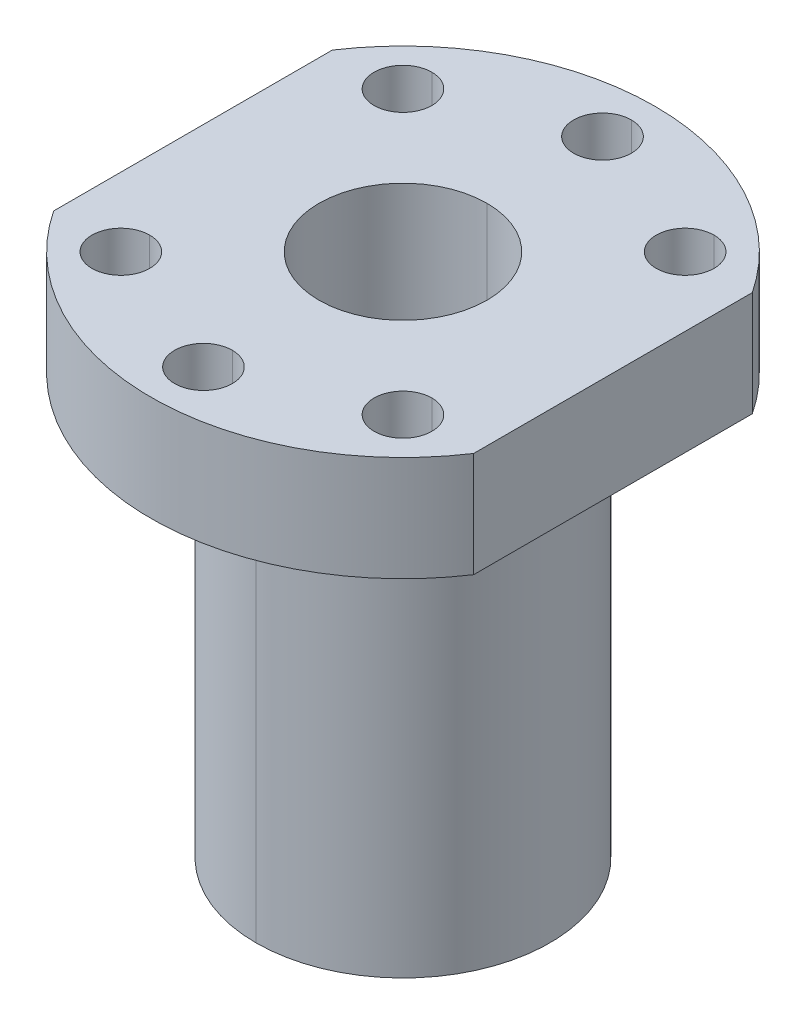
ISO-10303-21;
HEADER;
FILE_DESCRIPTION(('STEP AP214'),'2;1');
FILE_NAME('part.step','',(''),(''),'','','');
FILE_SCHEMA(('AUTOMOTIVE_DESIGN { 1 0 10303 214 1 1 1 1 }'));
ENDSEC;
DATA;
#1=APPLICATION_CONTEXT('core data for automotive mechanical design processes');
#2=APPLICATION_PROTOCOL_DEFINITION('international standard','automotive_design',2000,#1);
#3=PRODUCT_CONTEXT('',#1,'mechanical');
#4=PRODUCT('Part','Part','',(#3));
#5=PRODUCT_RELATED_PRODUCT_CATEGORY('part','',(#4));
#6=PRODUCT_DEFINITION_FORMATION('','',#4);
#7=PRODUCT_DEFINITION_CONTEXT('part definition',#1,'design');
#8=PRODUCT_DEFINITION('design','',#6,#7);
#9=PRODUCT_DEFINITION_SHAPE('','',#8);
#10=(LENGTH_UNIT() NAMED_UNIT(*) SI_UNIT(.MILLI.,.METRE.));
#11=(NAMED_UNIT(*) PLANE_ANGLE_UNIT() SI_UNIT($,.RADIAN.));
#12=(NAMED_UNIT(*) SI_UNIT($,.STERADIAN.) SOLID_ANGLE_UNIT());
#13=UNCERTAINTY_MEASURE_WITH_UNIT(LENGTH_MEASURE(1.E-05),#10,'distance_accuracy_value','');
#14=(GEOMETRIC_REPRESENTATION_CONTEXT(3) GLOBAL_UNCERTAINTY_ASSIGNED_CONTEXT((#13)) GLOBAL_UNIT_ASSIGNED_CONTEXT((#10,
#11,#12)) REPRESENTATION_CONTEXT('',''));
#15=CARTESIAN_POINT('',(0.,0.,0.));
#16=DIRECTION('',(0.,0.,1.));
#17=DIRECTION('',(1.,0.,0.));
#18=AXIS2_PLACEMENT_3D('',#15,#16,#17);
#19=CARTESIAN_POINT('',(-13.4350288425443,50.,13.4350288425446));
#20=DIRECTION('',(0.,1.,0.));
#21=DIRECTION('',(0.,0.,1.));
#22=AXIS2_PLACEMENT_3D('',#19,#20,#21);
#23=CYLINDRICAL_SURFACE('',#22,2.75);
#24=DIRECTION('',(0.,1.,0.));
#25=VECTOR('',#24,1.);
#26=CARTESIAN_POINT('',(-13.4350288425443,50.,10.6850288425446));
#27=LINE('',#26,#25);
#28=CARTESIAN_POINT('',(-13.4350288425443,40.,10.6850288425446));
#29=VERTEX_POINT('',#28);
#30=CARTESIAN_POINT('',(-13.4350288425443,50.,10.6850288425446));
#31=VERTEX_POINT('',#30);
#32=EDGE_CURVE('E430',#29,#31,#27,.T.);
#33=ORIENTED_EDGE('',*,*,#32,.F.);
#34=CARTESIAN_POINT('',(-13.4350288425443,40.,13.4350288425446));
#35=DIRECTION('',(0.,1.,0.));
#36=DIRECTION('',(0.,0.,1.));
#37=AXIS2_PLACEMENT_3D('',#34,#35,#36);
#38=CIRCLE('',#37,2.75);
#39=CARTESIAN_POINT('',(-13.4350288425443,40.,16.1850288425446));
#40=VERTEX_POINT('',#39);
#41=EDGE_CURVE('E233',#40,#29,#38,.T.);
#42=ORIENTED_EDGE('',*,*,#41,.F.);
#43=DIRECTION('',(0.,1.,0.));
#44=VECTOR('',#43,1.);
#45=CARTESIAN_POINT('',(-13.4350288425443,50.,16.1850288425446));
#46=LINE('',#45,#44);
#47=CARTESIAN_POINT('',(-13.4350288425443,50.,16.1850288425446));
#48=VERTEX_POINT('',#47);
#49=EDGE_CURVE('E271',#40,#48,#46,.T.);
#50=ORIENTED_EDGE('',*,*,#49,.T.);
#51=CARTESIAN_POINT('',(-13.4350288425443,50.,13.4350288425446));
#52=DIRECTION('',(0.,1.,0.));
#53=DIRECTION('',(0.,0.,1.));
#54=AXIS2_PLACEMENT_3D('',#51,#52,#53);
#55=CIRCLE('',#54,2.75);
#56=EDGE_CURVE('E223',#48,#31,#55,.T.);
#57=ORIENTED_EDGE('',*,*,#56,.T.);
#58=EDGE_LOOP('',(#33,#42,#50,#57));
#59=FACE_BOUND('',#58,.T.);
#60=ADVANCED_FACE('F16',(#59),#23,.F.);
#61=CARTESIAN_POINT('',(-13.4350288425446,50.,-13.4350288425443));
#62=DIRECTION('',(0.,1.,0.));
#63=DIRECTION('',(0.,0.,1.));
#64=AXIS2_PLACEMENT_3D('',#61,#62,#63);
#65=CYLINDRICAL_SURFACE('',#64,2.75);
#66=DIRECTION('',(0.,1.,0.));
#67=VECTOR('',#66,1.);
#68=CARTESIAN_POINT('',(-13.4350288425446,50.,-16.1850288425443));
#69=LINE('',#68,#67);
#70=CARTESIAN_POINT('',(-13.4350288425446,40.,-16.1850288425443));
#71=VERTEX_POINT('',#70);
#72=CARTESIAN_POINT('',(-13.4350288425446,50.,-16.1850288425443));
#73=VERTEX_POINT('',#72);
#74=EDGE_CURVE('E279',#71,#73,#69,.T.);
#75=ORIENTED_EDGE('',*,*,#74,.F.);
#76=CARTESIAN_POINT('',(-13.4350288425446,40.,-13.4350288425443));
#77=DIRECTION('',(0.,1.,0.));
#78=DIRECTION('',(0.,0.,1.));
#79=AXIS2_PLACEMENT_3D('',#76,#77,#78);
#80=CIRCLE('',#79,2.75);
#81=CARTESIAN_POINT('',(-13.4350288425446,40.,-10.6850288425443));
#82=VERTEX_POINT('',#81);
#83=EDGE_CURVE('E237',#82,#71,#80,.T.);
#84=ORIENTED_EDGE('',*,*,#83,.F.);
#85=DIRECTION('',(0.,1.,0.));
#86=VECTOR('',#85,1.);
#87=CARTESIAN_POINT('',(-13.4350288425446,50.,-10.6850288425443));
#88=LINE('',#87,#86);
#89=CARTESIAN_POINT('',(-13.4350288425446,50.,-10.6850288425443));
#90=VERTEX_POINT('',#89);
#91=EDGE_CURVE('E294',#82,#90,#88,.T.);
#92=ORIENTED_EDGE('',*,*,#91,.T.);
#93=CARTESIAN_POINT('',(-13.4350288425446,50.,-13.4350288425443));
#94=DIRECTION('',(0.,1.,0.));
#95=DIRECTION('',(0.,0.,1.));
#96=AXIS2_PLACEMENT_3D('',#93,#94,#95);
#97=CIRCLE('',#96,2.75);
#98=EDGE_CURVE('E226',#90,#73,#97,.T.);
#99=ORIENTED_EDGE('',*,*,#98,.T.);
#100=EDGE_LOOP('',(#75,#84,#92,#99));
#101=FACE_BOUND('',#100,.T.);
#102=ADVANCED_FACE('F827',(#101),#65,.F.);
#103=CARTESIAN_POINT('',(0.,50.,-19.));
#104=DIRECTION('',(0.,1.,0.));
#105=DIRECTION('',(0.,0.,1.));
#106=AXIS2_PLACEMENT_3D('',#103,#104,#105);
#107=CYLINDRICAL_SURFACE('',#106,2.75);
#108=DIRECTION('',(0.,1.,0.));
#109=VECTOR('',#108,1.);
#110=CARTESIAN_POINT('',(0.,50.,-21.75));
#111=LINE('',#110,#109);
#112=CARTESIAN_POINT('',(0.,40.,-21.75));
#113=VERTEX_POINT('',#112);
#114=CARTESIAN_POINT('',(0.,50.,-21.75));
#115=VERTEX_POINT('',#114);
#116=EDGE_CURVE('E286',#113,#115,#111,.T.);
#117=ORIENTED_EDGE('',*,*,#116,.F.);
#118=CARTESIAN_POINT('',(0.,40.,-19.));
#119=DIRECTION('',(0.,1.,0.));
#120=DIRECTION('',(0.,0.,1.));
#121=AXIS2_PLACEMENT_3D('',#118,#119,#120);
#122=CIRCLE('',#121,2.75);
#123=CARTESIAN_POINT('',(0.,40.,-16.25));
#124=VERTEX_POINT('',#123);
#125=EDGE_CURVE('E241',#124,#113,#122,.T.);
#126=ORIENTED_EDGE('',*,*,#125,.F.);
#127=DIRECTION('',(0.,1.,0.));
#128=VECTOR('',#127,1.);
#129=CARTESIAN_POINT('',(0.,50.,-16.25));
#130=LINE('',#129,#128);
#131=CARTESIAN_POINT('',(0.,50.,-16.25));
#132=VERTEX_POINT('',#131);
#133=EDGE_CURVE('E269',#124,#132,#130,.T.);
#134=ORIENTED_EDGE('',*,*,#133,.T.);
#135=CARTESIAN_POINT('',(0.,50.,-19.));
#136=DIRECTION('',(0.,1.,0.));
#137=DIRECTION('',(0.,0.,1.));
#138=AXIS2_PLACEMENT_3D('',#135,#136,#137);
#139=CIRCLE('',#138,2.75);
#140=EDGE_CURVE('E332',#132,#115,#139,.T.);
#141=ORIENTED_EDGE('',*,*,#140,.T.);
#142=EDGE_LOOP('',(#117,#126,#134,#141));
#143=FACE_BOUND('',#142,.T.);
#144=ADVANCED_FACE('F497',(#143),#107,.F.);
#145=CARTESIAN_POINT('',(13.4350288425444,50.,-13.4350288425445));
#146=DIRECTION('',(0.,1.,0.));
#147=DIRECTION('',(0.,0.,1.));
#148=AXIS2_PLACEMENT_3D('',#145,#146,#147);
#149=CYLINDRICAL_SURFACE('',#148,2.75);
#150=DIRECTION('',(0.,1.,0.));
#151=VECTOR('',#150,1.);
#152=CARTESIAN_POINT('',(13.4350288425444,50.,-16.1850288425445));
#153=LINE('',#152,#151);
#154=CARTESIAN_POINT('',(13.4350288425444,40.,-16.1850288425445));
#155=VERTEX_POINT('',#154);
#156=CARTESIAN_POINT('',(13.4350288425444,50.,-16.1850288425445));
#157=VERTEX_POINT('',#156);
#158=EDGE_CURVE('E299',#155,#157,#153,.T.);
#159=ORIENTED_EDGE('',*,*,#158,.F.);
#160=CARTESIAN_POINT('',(13.4350288425444,40.,-13.4350288425445));
#161=DIRECTION('',(0.,1.,0.));
#162=DIRECTION('',(0.,0.,1.));
#163=AXIS2_PLACEMENT_3D('',#160,#161,#162);
#164=CIRCLE('',#163,2.75);
#165=CARTESIAN_POINT('',(13.4350288425444,40.,-10.6850288425445));
#166=VERTEX_POINT('',#165);
#167=EDGE_CURVE('E242',#166,#155,#164,.T.);
#168=ORIENTED_EDGE('',*,*,#167,.F.);
#169=DIRECTION('',(0.,1.,0.));
#170=VECTOR('',#169,1.);
#171=CARTESIAN_POINT('',(13.4350288425444,50.,-10.6850288425445));
#172=LINE('',#171,#170);
#173=CARTESIAN_POINT('',(13.4350288425444,50.,-10.6850288425445));
#174=VERTEX_POINT('',#173);
#175=EDGE_CURVE('E308',#166,#174,#172,.T.);
#176=ORIENTED_EDGE('',*,*,#175,.T.);
#177=CARTESIAN_POINT('',(13.4350288425444,50.,-13.4350288425445));
#178=DIRECTION('',(0.,1.,0.));
#179=DIRECTION('',(0.,0.,1.));
#180=AXIS2_PLACEMENT_3D('',#177,#178,#179);
#181=CIRCLE('',#180,2.75);
#182=EDGE_CURVE('E328',#174,#157,#181,.T.);
#183=ORIENTED_EDGE('',*,*,#182,.T.);
#184=EDGE_LOOP('',(#159,#168,#176,#183));
#185=FACE_BOUND('',#184,.T.);
#186=ADVANCED_FACE('F742',(#185),#149,.F.);
#187=CARTESIAN_POINT('',(13.4350288425445,50.,13.4350288425444));
#188=DIRECTION('',(0.,1.,0.));
#189=DIRECTION('',(0.,0.,1.));
#190=AXIS2_PLACEMENT_3D('',#187,#188,#189);
#191=CYLINDRICAL_SURFACE('',#190,2.75);
#192=DIRECTION('',(0.,1.,0.));
#193=VECTOR('',#192,1.);
#194=CARTESIAN_POINT('',(13.4350288425445,50.,10.6850288425444));
#195=LINE('',#194,#193);
#196=CARTESIAN_POINT('',(13.4350288425445,40.,10.6850288425444));
#197=VERTEX_POINT('',#196);
#198=CARTESIAN_POINT('',(13.4350288425445,50.,10.6850288425444));
#199=VERTEX_POINT('',#198);
#200=EDGE_CURVE('E312',#197,#199,#195,.T.);
#201=ORIENTED_EDGE('',*,*,#200,.F.);
#202=CARTESIAN_POINT('',(13.4350288425445,40.,13.4350288425444));
#203=DIRECTION('',(0.,1.,0.));
#204=DIRECTION('',(0.,0.,1.));
#205=AXIS2_PLACEMENT_3D('',#202,#203,#204);
#206=CIRCLE('',#205,2.75);
#207=CARTESIAN_POINT('',(13.4350288425445,40.,16.1850288425444));
#208=VERTEX_POINT('',#207);
#209=EDGE_CURVE('E246',#208,#197,#206,.T.);
#210=ORIENTED_EDGE('',*,*,#209,.F.);
#211=DIRECTION('',(0.,1.,0.));
#212=VECTOR('',#211,1.);
#213=CARTESIAN_POINT('',(13.4350288425445,50.,16.1850288425444));
#214=LINE('',#213,#212);
#215=CARTESIAN_POINT('',(13.4350288425445,50.,16.1850288425444));
#216=VERTEX_POINT('',#215);
#217=EDGE_CURVE('E321',#208,#216,#214,.T.);
#218=ORIENTED_EDGE('',*,*,#217,.T.);
#219=CARTESIAN_POINT('',(13.4350288425445,50.,13.4350288425444));
#220=DIRECTION('',(0.,1.,0.));
#221=DIRECTION('',(0.,0.,1.));
#222=AXIS2_PLACEMENT_3D('',#219,#220,#221);
#223=CIRCLE('',#222,2.75);
#224=EDGE_CURVE('E204',#216,#199,#223,.T.);
#225=ORIENTED_EDGE('',*,*,#224,.T.);
#226=EDGE_LOOP('',(#201,#210,#218,#225));
#227=FACE_BOUND('',#226,.T.);
#228=ADVANCED_FACE('F402',(#227),#191,.F.);
#229=CARTESIAN_POINT('',(0.,50.,19.));
#230=DIRECTION('',(0.,1.,0.));
#231=DIRECTION('',(0.,0.,1.));
#232=AXIS2_PLACEMENT_3D('',#229,#230,#231);
#233=CYLINDRICAL_SURFACE('',#232,2.75);
#234=DIRECTION('',(0.,1.,0.));
#235=VECTOR('',#234,1.);
#236=CARTESIAN_POINT('',(0.,50.,16.25));
#237=LINE('',#236,#235);
#238=CARTESIAN_POINT('',(0.,40.,16.25));
#239=VERTEX_POINT('',#238);
#240=CARTESIAN_POINT('',(0.,50.,16.25));
#241=VERTEX_POINT('',#240);
#242=EDGE_CURVE('E322',#239,#241,#237,.T.);
#243=ORIENTED_EDGE('',*,*,#242,.F.);
#244=CARTESIAN_POINT('',(0.,40.,19.));
#245=DIRECTION('',(0.,1.,0.));
#246=DIRECTION('',(0.,0.,1.));
#247=AXIS2_PLACEMENT_3D('',#244,#245,#246);
#248=CIRCLE('',#247,2.75);
#249=CARTESIAN_POINT('',(0.,40.,21.75));
#250=VERTEX_POINT('',#249);
#251=EDGE_CURVE('E250',#250,#239,#248,.T.);
#252=ORIENTED_EDGE('',*,*,#251,.F.);
#253=DIRECTION('',(0.,1.,0.));
#254=VECTOR('',#253,1.);
#255=CARTESIAN_POINT('',(0.,50.,21.75));
#256=LINE('',#255,#254);
#257=CARTESIAN_POINT('',(0.,50.,21.75));
#258=VERTEX_POINT('',#257);
#259=EDGE_CURVE('E167',#250,#258,#256,.T.);
#260=ORIENTED_EDGE('',*,*,#259,.T.);
#261=CARTESIAN_POINT('',(0.,50.,19.));
#262=DIRECTION('',(0.,1.,0.));
#263=DIRECTION('',(0.,0.,1.));
#264=AXIS2_PLACEMENT_3D('',#261,#262,#263);
#265=CIRCLE('',#264,2.75);
#266=EDGE_CURVE('E150',#258,#241,#265,.T.);
#267=ORIENTED_EDGE('',*,*,#266,.T.);
#268=EDGE_LOOP('',(#243,#252,#260,#267));
#269=FACE_BOUND('',#268,.T.);
#270=ADVANCED_FACE('F352',(#269),#233,.F.);
#271=CARTESIAN_POINT('',(20.,40.,24.));
#272=DIRECTION('',(1.,0.,0.));
#273=DIRECTION('',(0.,1.,0.));
#274=AXIS2_PLACEMENT_3D('',#271,#272,#273);
#275=PLANE('',#274);
#276=DIRECTION('',(0.,-1.,0.));
#277=VECTOR('',#276,1.);
#278=CARTESIAN_POINT('',(20.,50.,13.2664991614216));
#279=LINE('',#278,#277);
#280=CARTESIAN_POINT('',(20.,50.,13.2664991614216));
#281=VERTEX_POINT('',#280);
#282=CARTESIAN_POINT('',(20.,40.,13.2664991614216));
#283=VERTEX_POINT('',#282);
#284=EDGE_CURVE('E200',#281,#283,#279,.T.);
#285=ORIENTED_EDGE('',*,*,#284,.T.);
#286=DIRECTION('',(0.,0.,-1.));
#287=VECTOR('',#286,1.);
#288=CARTESIAN_POINT('',(20.0000000000001,40.,0.));
#289=LINE('',#288,#287);
#290=CARTESIAN_POINT('',(20.0000000000001,40.,-13.2664991614216));
#291=VERTEX_POINT('',#290);
#292=EDGE_CURVE('E37',#283,#291,#289,.T.);
#293=ORIENTED_EDGE('',*,*,#292,.T.);
#294=DIRECTION('',(0.,1.,0.));
#295=VECTOR('',#294,1.);
#296=CARTESIAN_POINT('',(20.0000000000001,50.,-13.2664991614216));
#297=LINE('',#296,#295);
#298=CARTESIAN_POINT('',(20.0000000000001,50.,-13.2664991614216));
#299=VERTEX_POINT('',#298);
#300=EDGE_CURVE('E213',#291,#299,#297,.T.);
#301=ORIENTED_EDGE('',*,*,#300,.T.);
#302=DIRECTION('',(0.,0.,-1.));
#303=VECTOR('',#302,1.);
#304=CARTESIAN_POINT('',(20.,50.,24.));
#305=LINE('',#304,#303);
#306=EDGE_CURVE('E51',#281,#299,#305,.T.);
#307=ORIENTED_EDGE('',*,*,#306,.F.);
#308=EDGE_LOOP('',(#285,#293,#301,#307));
#309=FACE_BOUND('',#308,.T.);
#310=ADVANCED_FACE('F796',(#309),#275,.T.);
#311=CARTESIAN_POINT('',(-20.,40.,24.));
#312=DIRECTION('',(-1.,0.,0.));
#313=DIRECTION('',(0.,0.,1.));
#314=AXIS2_PLACEMENT_3D('',#311,#312,#313);
#315=PLANE('',#314);
#316=DIRECTION('',(0.,-1.,0.));
#317=VECTOR('',#316,1.);
#318=CARTESIAN_POINT('',(-20.0000000000001,50.,-13.2664991614216));
#319=LINE('',#318,#317);
#320=CARTESIAN_POINT('',(-20.0000000000001,50.,-13.2664991614216));
#321=VERTEX_POINT('',#320);
#322=CARTESIAN_POINT('',(-20.0000000000001,40.,-13.2664991614216));
#323=VERTEX_POINT('',#322);
#324=EDGE_CURVE('E191',#321,#323,#319,.T.);
#325=ORIENTED_EDGE('',*,*,#324,.T.);
#326=DIRECTION('',(0.,0.,1.));
#327=VECTOR('',#326,1.);
#328=CARTESIAN_POINT('',(-20.0000000000001,40.,0.));
#329=LINE('',#328,#327);
#330=CARTESIAN_POINT('',(-20.0000000000001,40.,13.2664991614216));
#331=VERTEX_POINT('',#330);
#332=EDGE_CURVE('E230',#323,#331,#329,.T.);
#333=ORIENTED_EDGE('',*,*,#332,.T.);
#334=DIRECTION('',(0.,1.,0.));
#335=VECTOR('',#334,1.);
#336=CARTESIAN_POINT('',(-20.0000000000001,50.,13.2664991614216));
#337=LINE('',#336,#335);
#338=CARTESIAN_POINT('',(-20.0000000000001,50.,13.2664991614216));
#339=VERTEX_POINT('',#338);
#340=EDGE_CURVE('E195',#331,#339,#337,.T.);
#341=ORIENTED_EDGE('',*,*,#340,.T.);
#342=DIRECTION('',(0.,0.,1.));
#343=VECTOR('',#342,1.);
#344=CARTESIAN_POINT('',(-20.,50.,24.));
#345=LINE('',#344,#343);
#346=EDGE_CURVE('E120',#321,#339,#345,.T.);
#347=ORIENTED_EDGE('',*,*,#346,.F.);
#348=EDGE_LOOP('',(#325,#333,#341,#347));
#349=FACE_BOUND('',#348,.T.);
#350=ADVANCED_FACE('F764',(#349),#315,.T.);
#351=CARTESIAN_POINT('',(0.,-0.001000000000001,0.));
#352=DIRECTION('',(0.,1.,0.));
#353=DIRECTION('',(0.,0.,1.));
#354=AXIS2_PLACEMENT_3D('',#351,#352,#353);
#355=CYLINDRICAL_SURFACE('',#354,8.);
#356=DIRECTION('',(0.,1.,0.));
#357=VECTOR('',#356,1.);
#358=CARTESIAN_POINT('',(0.,-0.001000000000001,-8.00000000000001));
#359=LINE('',#358,#357);
#360=CARTESIAN_POINT('',(0.,0.,-8.00000000000001));
#361=VERTEX_POINT('',#360);
#362=CARTESIAN_POINT('',(0.,50.,-8.00000000000001));
#363=VERTEX_POINT('',#362);
#364=EDGE_CURVE('E143',#361,#363,#359,.T.);
#365=ORIENTED_EDGE('',*,*,#364,.F.);
#366=CARTESIAN_POINT('',(0.,0.,0.));
#367=DIRECTION('',(0.,-1.,0.));
#368=DIRECTION('',(0.,0.,1.));
#369=AXIS2_PLACEMENT_3D('',#366,#367,#368);
#370=CIRCLE('',#369,8.);
#371=CARTESIAN_POINT('',(0.,0.,8.00000000000001));
#372=VERTEX_POINT('',#371);
#373=EDGE_CURVE('E11',#361,#372,#370,.T.);
#374=ORIENTED_EDGE('',*,*,#373,.T.);
#375=DIRECTION('',(0.,1.,0.));
#376=VECTOR('',#375,1.);
#377=CARTESIAN_POINT('',(0.,-0.001000000000001,8.00000000000001));
#378=LINE('',#377,#376);
#379=CARTESIAN_POINT('',(0.,50.,8.00000000000001));
#380=VERTEX_POINT('',#379);
#381=EDGE_CURVE('E146',#372,#380,#378,.T.);
#382=ORIENTED_EDGE('',*,*,#381,.T.);
#383=CARTESIAN_POINT('',(0.,50.,0.));
#384=DIRECTION('',(0.,1.,0.));
#385=DIRECTION('',(0.,0.,1.));
#386=AXIS2_PLACEMENT_3D('',#383,#384,#385);
#387=CIRCLE('',#386,8.);
#388=EDGE_CURVE('E139',#380,#363,#387,.T.);
#389=ORIENTED_EDGE('',*,*,#388,.T.);
#390=EDGE_LOOP('',(#365,#374,#382,#389));
#391=FACE_BOUND('',#390,.T.);
#392=ADVANCED_FACE('F141',(#391),#355,.F.);
#393=CARTESIAN_POINT('',(0.,0.,0.));
#394=DIRECTION('',(0.,1.,0.));
#395=DIRECTION('',(1.,0.,0.));
#396=AXIS2_PLACEMENT_3D('',#393,#394,#395);
#397=PLANE('',#396);
#398=CARTESIAN_POINT('',(0.,0.,0.));
#399=DIRECTION('',(0.,-1.,0.));
#400=DIRECTION('',(0.,0.,1.));
#401=AXIS2_PLACEMENT_3D('',#398,#399,#400);
#402=CIRCLE('',#401,8.);
#403=EDGE_CURVE('E160',#372,#361,#402,.T.);
#404=ORIENTED_EDGE('',*,*,#403,.F.);
#405=ORIENTED_EDGE('',*,*,#373,.F.);
#406=EDGE_LOOP('',(#404,#405));
#407=FACE_BOUND('',#406,.T.);
#408=CARTESIAN_POINT('',(0.,0.,0.));
#409=DIRECTION('',(0.,1.,0.));
#410=DIRECTION('',(0.,0.,1.));
#411=AXIS2_PLACEMENT_3D('',#408,#409,#410);
#412=CIRCLE('',#411,14.);
#413=CARTESIAN_POINT('',(0.,0.,-14.));
#414=VERTEX_POINT('',#413);
#415=CARTESIAN_POINT('',(0.,0.,14.));
#416=VERTEX_POINT('',#415);
#417=EDGE_CURVE('E24',#414,#416,#412,.T.);
#418=ORIENTED_EDGE('',*,*,#417,.F.);
#419=CARTESIAN_POINT('',(0.,0.,0.));
#420=DIRECTION('',(0.,1.,0.));
#421=DIRECTION('',(0.,0.,1.));
#422=AXIS2_PLACEMENT_3D('',#419,#420,#421);
#423=CIRCLE('',#422,14.);
#424=EDGE_CURVE('E178',#416,#414,#423,.T.);
#425=ORIENTED_EDGE('',*,*,#424,.F.);
#426=EDGE_LOOP('',(#418,#425));
#427=FACE_BOUND('',#426,.T.);
#428=ADVANCED_FACE('F657',(#407,#427),#397,.F.);
#429=CARTESIAN_POINT('',(0.,40.,0.));
#430=DIRECTION('',(0.,-1.,0.));
#431=DIRECTION('',(0.,0.,-1.));
#432=AXIS2_PLACEMENT_3D('',#429,#430,#431);
#433=CYLINDRICAL_SURFACE('',#432,14.);
#434=DIRECTION('',(0.,-1.,0.));
#435=VECTOR('',#434,1.);
#436=CARTESIAN_POINT('',(0.,40.,14.));
#437=LINE('',#436,#435);
#438=CARTESIAN_POINT('',(0.,40.,14.));
#439=VERTEX_POINT('',#438);
#440=EDGE_CURVE('E170',#439,#416,#437,.T.);
#441=ORIENTED_EDGE('',*,*,#440,.F.);
#442=CARTESIAN_POINT('',(0.,40.,0.));
#443=DIRECTION('',(0.,1.,0.));
#444=DIRECTION('',(0.,0.,1.));
#445=AXIS2_PLACEMENT_3D('',#442,#443,#444);
#446=CIRCLE('',#445,14.);
#447=CARTESIAN_POINT('',(0.,40.,-14.));
#448=VERTEX_POINT('',#447);
#449=EDGE_CURVE('E252',#448,#439,#446,.T.);
#450=ORIENTED_EDGE('',*,*,#449,.F.);
#451=DIRECTION('',(0.,-1.,0.));
#452=VECTOR('',#451,1.);
#453=CARTESIAN_POINT('',(0.,40.,-14.));
#454=LINE('',#453,#452);
#455=EDGE_CURVE('E182',#448,#414,#454,.T.);
#456=ORIENTED_EDGE('',*,*,#455,.T.);
#457=ORIENTED_EDGE('',*,*,#417,.T.);
#458=EDGE_LOOP('',(#441,#450,#456,#457));
#459=FACE_BOUND('',#458,.T.);
#460=ADVANCED_FACE('F661',(#459),#433,.T.);
#461=CARTESIAN_POINT('',(0.,40.,0.));
#462=DIRECTION('',(0.,1.,0.));
#463=DIRECTION('',(1.,0.,0.));
#464=AXIS2_PLACEMENT_3D('',#461,#462,#463);
#465=PLANE('',#464);
#466=ORIENTED_EDGE('',*,*,#449,.T.);
#467=CARTESIAN_POINT('',(0.,40.,0.));
#468=DIRECTION('',(0.,1.,0.));
#469=DIRECTION('',(0.,0.,1.));
#470=AXIS2_PLACEMENT_3D('',#467,#468,#469);
#471=CIRCLE('',#470,14.);
#472=EDGE_CURVE('E174',#439,#448,#471,.T.);
#473=ORIENTED_EDGE('',*,*,#472,.T.);
#474=EDGE_LOOP('',(#466,#473));
#475=FACE_BOUND('',#474,.T.);
#476=ORIENTED_EDGE('',*,*,#251,.T.);
#477=CARTESIAN_POINT('',(0.,40.,19.));
#478=DIRECTION('',(0.,1.,0.));
#479=DIRECTION('',(0.,0.,1.));
#480=AXIS2_PLACEMENT_3D('',#477,#478,#479);
#481=CIRCLE('',#480,2.75);
#482=EDGE_CURVE('E327',#239,#250,#481,.T.);
#483=ORIENTED_EDGE('',*,*,#482,.T.);
#484=EDGE_LOOP('',(#476,#483));
#485=FACE_BOUND('',#484,.T.);
#486=ORIENTED_EDGE('',*,*,#209,.T.);
#487=CARTESIAN_POINT('',(13.4350288425445,40.,13.4350288425444));
#488=DIRECTION('',(0.,1.,0.));
#489=DIRECTION('',(0.,0.,1.));
#490=AXIS2_PLACEMENT_3D('',#487,#488,#489);
#491=CIRCLE('',#490,2.75);
#492=EDGE_CURVE('E317',#197,#208,#491,.T.);
#493=ORIENTED_EDGE('',*,*,#492,.T.);
#494=EDGE_LOOP('',(#486,#493));
#495=FACE_BOUND('',#494,.T.);
#496=ORIENTED_EDGE('',*,*,#167,.T.);
#497=CARTESIAN_POINT('',(13.4350288425444,40.,-13.4350288425445));
#498=DIRECTION('',(0.,1.,0.));
#499=DIRECTION('',(0.,0.,1.));
#500=AXIS2_PLACEMENT_3D('',#497,#498,#499);
#501=CIRCLE('',#500,2.75);
#502=EDGE_CURVE('E304',#155,#166,#501,.T.);
#503=ORIENTED_EDGE('',*,*,#502,.T.);
#504=EDGE_LOOP('',(#496,#503));
#505=FACE_BOUND('',#504,.T.);
#506=ORIENTED_EDGE('',*,*,#125,.T.);
#507=CARTESIAN_POINT('',(0.,40.,-19.));
#508=DIRECTION('',(0.,1.,0.));
#509=DIRECTION('',(0.,0.,1.));
#510=AXIS2_PLACEMENT_3D('',#507,#508,#509);
#511=CIRCLE('',#510,2.75);
#512=EDGE_CURVE('E298',#113,#124,#511,.T.);
#513=ORIENTED_EDGE('',*,*,#512,.T.);
#514=EDGE_LOOP('',(#506,#513));
#515=FACE_BOUND('',#514,.T.);
#516=ORIENTED_EDGE('',*,*,#83,.T.);
#517=CARTESIAN_POINT('',(-13.4350288425446,40.,-13.4350288425443));
#518=DIRECTION('',(0.,1.,0.));
#519=DIRECTION('',(0.,0.,1.));
#520=AXIS2_PLACEMENT_3D('',#517,#518,#519);
#521=CIRCLE('',#520,2.75);
#522=EDGE_CURVE('E274',#71,#82,#521,.T.);
#523=ORIENTED_EDGE('',*,*,#522,.T.);
#524=EDGE_LOOP('',(#516,#523));
#525=FACE_BOUND('',#524,.T.);
#526=ORIENTED_EDGE('',*,*,#41,.T.);
#527=CARTESIAN_POINT('',(-13.4350288425443,40.,13.4350288425446));
#528=DIRECTION('',(0.,1.,0.));
#529=DIRECTION('',(0.,0.,1.));
#530=AXIS2_PLACEMENT_3D('',#527,#528,#529);
#531=CIRCLE('',#530,2.75);
#532=EDGE_CURVE('E426',#29,#40,#531,.T.);
#533=ORIENTED_EDGE('',*,*,#532,.T.);
#534=EDGE_LOOP('',(#526,#533));
#535=FACE_BOUND('',#534,.T.);
#536=ORIENTED_EDGE('',*,*,#292,.F.);
#537=CARTESIAN_POINT('',(0.,40.,0.));
#538=DIRECTION('',(0.,1.,0.));
#539=DIRECTION('',(0.,0.,1.));
#540=AXIS2_PLACEMENT_3D('',#537,#538,#539);
#541=CIRCLE('',#540,24.);
#542=EDGE_CURVE('E196',#331,#283,#541,.T.);
#543=ORIENTED_EDGE('',*,*,#542,.F.);
#544=ORIENTED_EDGE('',*,*,#332,.F.);
#545=CARTESIAN_POINT('',(0.,40.,0.));
#546=DIRECTION('',(0.,1.,0.));
#547=DIRECTION('',(0.,0.,1.));
#548=AXIS2_PLACEMENT_3D('',#545,#546,#547);
#549=CIRCLE('',#548,24.);
#550=CARTESIAN_POINT('',(0.,40.,-24.));
#551=VERTEX_POINT('',#550);
#552=EDGE_CURVE('E187',#551,#323,#549,.T.);
#553=ORIENTED_EDGE('',*,*,#552,.F.);
#554=CARTESIAN_POINT('',(0.,40.,0.));
#555=DIRECTION('',(0.,1.,0.));
#556=DIRECTION('',(0.,0.,1.));
#557=AXIS2_PLACEMENT_3D('',#554,#555,#556);
#558=CIRCLE('',#557,24.);
#559=EDGE_CURVE('E216',#291,#551,#558,.T.);
#560=ORIENTED_EDGE('',*,*,#559,.F.);
#561=EDGE_LOOP('',(#536,#543,#544,#553,#560));
#562=FACE_BOUND('',#561,.T.);
#563=ADVANCED_FACE('F491',(#475,#485,#495,#505,#515,#525,#535,#562),#465,.F.);
#564=CARTESIAN_POINT('',(0.,50.,0.));
#565=DIRECTION('',(0.,1.,0.));
#566=DIRECTION('',(1.,0.,0.));
#567=AXIS2_PLACEMENT_3D('',#564,#565,#566);
#568=PLANE('',#567);
#569=ORIENTED_EDGE('',*,*,#388,.F.);
#570=CARTESIAN_POINT('',(0.,50.,0.));
#571=DIRECTION('',(0.,1.,0.));
#572=DIRECTION('',(0.,0.,1.));
#573=AXIS2_PLACEMENT_3D('',#570,#571,#572);
#574=CIRCLE('',#573,8.);
#575=EDGE_CURVE('E152',#363,#380,#574,.T.);
#576=ORIENTED_EDGE('',*,*,#575,.F.);
#577=EDGE_LOOP('',(#569,#576));
#578=FACE_BOUND('',#577,.T.);
#579=ORIENTED_EDGE('',*,*,#266,.F.);
#580=CARTESIAN_POINT('',(0.,50.,19.));
#581=DIRECTION('',(0.,1.,0.));
#582=DIRECTION('',(0.,0.,1.));
#583=AXIS2_PLACEMENT_3D('',#580,#581,#582);
#584=CIRCLE('',#583,2.75);
#585=EDGE_CURVE('E326',#241,#258,#584,.T.);
#586=ORIENTED_EDGE('',*,*,#585,.F.);
#587=EDGE_LOOP('',(#579,#586));
#588=FACE_BOUND('',#587,.T.);
#589=ORIENTED_EDGE('',*,*,#224,.F.);
#590=CARTESIAN_POINT('',(13.4350288425445,50.,13.4350288425444));
#591=DIRECTION('',(0.,1.,0.));
#592=DIRECTION('',(0.,0.,1.));
#593=AXIS2_PLACEMENT_3D('',#590,#591,#592);
#594=CIRCLE('',#593,2.75);
#595=EDGE_CURVE('E316',#199,#216,#594,.T.);
#596=ORIENTED_EDGE('',*,*,#595,.F.);
#597=EDGE_LOOP('',(#589,#596));
#598=FACE_BOUND('',#597,.T.);
#599=ORIENTED_EDGE('',*,*,#182,.F.);
#600=CARTESIAN_POINT('',(13.4350288425444,50.,-13.4350288425445));
#601=DIRECTION('',(0.,1.,0.));
#602=DIRECTION('',(0.,0.,1.));
#603=AXIS2_PLACEMENT_3D('',#600,#601,#602);
#604=CIRCLE('',#603,2.75);
#605=EDGE_CURVE('E303',#157,#174,#604,.T.);
#606=ORIENTED_EDGE('',*,*,#605,.F.);
#607=EDGE_LOOP('',(#599,#606));
#608=FACE_BOUND('',#607,.T.);
#609=ORIENTED_EDGE('',*,*,#140,.F.);
#610=CARTESIAN_POINT('',(0.,50.,-19.));
#611=DIRECTION('',(0.,1.,0.));
#612=DIRECTION('',(0.,0.,1.));
#613=AXIS2_PLACEMENT_3D('',#610,#611,#612);
#614=CIRCLE('',#613,2.75);
#615=EDGE_CURVE('E282',#115,#132,#614,.T.);
#616=ORIENTED_EDGE('',*,*,#615,.F.);
#617=EDGE_LOOP('',(#609,#616));
#618=FACE_BOUND('',#617,.T.);
#619=ORIENTED_EDGE('',*,*,#98,.F.);
#620=CARTESIAN_POINT('',(-13.4350288425446,50.,-13.4350288425443));
#621=DIRECTION('',(0.,1.,0.));
#622=DIRECTION('',(0.,0.,1.));
#623=AXIS2_PLACEMENT_3D('',#620,#621,#622);
#624=CIRCLE('',#623,2.75);
#625=EDGE_CURVE('E290',#73,#90,#624,.T.);
#626=ORIENTED_EDGE('',*,*,#625,.F.);
#627=EDGE_LOOP('',(#619,#626));
#628=FACE_BOUND('',#627,.T.);
#629=ORIENTED_EDGE('',*,*,#56,.F.);
#630=CARTESIAN_POINT('',(-13.4350288425443,50.,13.4350288425446));
#631=DIRECTION('',(0.,1.,0.));
#632=DIRECTION('',(0.,0.,1.));
#633=AXIS2_PLACEMENT_3D('',#630,#631,#632);
#634=CIRCLE('',#633,2.75);
#635=EDGE_CURVE('E275',#31,#48,#634,.T.);
#636=ORIENTED_EDGE('',*,*,#635,.F.);
#637=EDGE_LOOP('',(#629,#636));
#638=FACE_BOUND('',#637,.T.);
#639=CARTESIAN_POINT('',(0.,50.,0.));
#640=DIRECTION('',(0.,1.,0.));
#641=DIRECTION('',(0.,0.,1.));
#642=AXIS2_PLACEMENT_3D('',#639,#640,#641);
#643=CIRCLE('',#642,24.);
#644=EDGE_CURVE('E207',#339,#281,#643,.T.);
#645=ORIENTED_EDGE('',*,*,#644,.T.);
#646=ORIENTED_EDGE('',*,*,#306,.T.);
#647=CARTESIAN_POINT('',(0.,50.,0.));
#648=DIRECTION('',(0.,1.,0.));
#649=DIRECTION('',(0.,0.,1.));
#650=AXIS2_PLACEMENT_3D('',#647,#648,#649);
#651=CIRCLE('',#650,24.);
#652=CARTESIAN_POINT('',(0.,50.,-24.));
#653=VERTEX_POINT('',#652);
#654=EDGE_CURVE('E210',#299,#653,#651,.T.);
#655=ORIENTED_EDGE('',*,*,#654,.T.);
#656=CARTESIAN_POINT('',(0.,50.,0.));
#657=DIRECTION('',(0.,1.,0.));
#658=DIRECTION('',(0.,0.,1.));
#659=AXIS2_PLACEMENT_3D('',#656,#657,#658);
#660=CIRCLE('',#659,24.);
#661=EDGE_CURVE('E183',#653,#321,#660,.T.);
#662=ORIENTED_EDGE('',*,*,#661,.T.);
#663=ORIENTED_EDGE('',*,*,#346,.T.);
#664=EDGE_LOOP('',(#645,#646,#655,#662,#663));
#665=FACE_BOUND('',#664,.T.);
#666=ADVANCED_FACE('F153',(#578,#588,#598,#608,#618,#628,#638,#665),#568,.T.);
#667=CARTESIAN_POINT('',(0.,50.,0.));
#668=DIRECTION('',(0.,-1.,0.));
#669=DIRECTION('',(0.,0.,-1.));
#670=AXIS2_PLACEMENT_3D('',#667,#668,#669);
#671=CYLINDRICAL_SURFACE('',#670,24.);
#672=DIRECTION('',(0.,-1.,0.));
#673=VECTOR('',#672,1.);
#674=CARTESIAN_POINT('',(0.,50.,-24.));
#675=LINE('',#674,#673);
#676=EDGE_CURVE('E186',#653,#551,#675,.T.);
#677=ORIENTED_EDGE('',*,*,#676,.F.);
#678=ORIENTED_EDGE('',*,*,#654,.F.);
#679=ORIENTED_EDGE('',*,*,#300,.F.);
#680=ORIENTED_EDGE('',*,*,#559,.T.);
#681=EDGE_LOOP('',(#677,#678,#679,#680));
#682=FACE_BOUND('',#681,.T.);
#683=ADVANCED_FACE('F719',(#682),#671,.T.);
#684=CARTESIAN_POINT('',(0.,50.,0.));
#685=DIRECTION('',(0.,-1.,0.));
#686=DIRECTION('',(0.,0.,-1.));
#687=AXIS2_PLACEMENT_3D('',#684,#685,#686);
#688=CYLINDRICAL_SURFACE('',#687,24.);
#689=ORIENTED_EDGE('',*,*,#340,.F.);
#690=ORIENTED_EDGE('',*,*,#542,.T.);
#691=ORIENTED_EDGE('',*,*,#284,.F.);
#692=ORIENTED_EDGE('',*,*,#644,.F.);
#693=EDGE_LOOP('',(#689,#690,#691,#692));
#694=FACE_BOUND('',#693,.T.);
#695=ADVANCED_FACE('F702',(#694),#688,.T.);
#696=CARTESIAN_POINT('',(0.,50.,0.));
#697=DIRECTION('',(0.,-1.,0.));
#698=DIRECTION('',(0.,0.,-1.));
#699=AXIS2_PLACEMENT_3D('',#696,#697,#698);
#700=CYLINDRICAL_SURFACE('',#699,24.);
#701=ORIENTED_EDGE('',*,*,#661,.F.);
#702=ORIENTED_EDGE('',*,*,#676,.T.);
#703=ORIENTED_EDGE('',*,*,#552,.T.);
#704=ORIENTED_EDGE('',*,*,#324,.F.);
#705=EDGE_LOOP('',(#701,#702,#703,#704));
#706=FACE_BOUND('',#705,.T.);
#707=ADVANCED_FACE('F697',(#706),#700,.T.);
#708=CARTESIAN_POINT('',(0.,40.,0.));
#709=DIRECTION('',(0.,-1.,0.));
#710=DIRECTION('',(0.,0.,-1.));
#711=AXIS2_PLACEMENT_3D('',#708,#709,#710);
#712=CYLINDRICAL_SURFACE('',#711,14.);
#713=ORIENTED_EDGE('',*,*,#472,.F.);
#714=ORIENTED_EDGE('',*,*,#440,.T.);
#715=ORIENTED_EDGE('',*,*,#424,.T.);
#716=ORIENTED_EDGE('',*,*,#455,.F.);
#717=EDGE_LOOP('',(#713,#714,#715,#716));
#718=FACE_BOUND('',#717,.T.);
#719=ADVANCED_FACE('F701',(#718),#712,.T.);
#720=CARTESIAN_POINT('',(0.,-0.001000000000001,0.));
#721=DIRECTION('',(0.,1.,0.));
#722=DIRECTION('',(0.,0.,1.));
#723=AXIS2_PLACEMENT_3D('',#720,#721,#722);
#724=CYLINDRICAL_SURFACE('',#723,8.);
#725=ORIENTED_EDGE('',*,*,#403,.T.);
#726=ORIENTED_EDGE('',*,*,#364,.T.);
#727=ORIENTED_EDGE('',*,*,#575,.T.);
#728=ORIENTED_EDGE('',*,*,#381,.F.);
#729=EDGE_LOOP('',(#725,#726,#727,#728));
#730=FACE_BOUND('',#729,.T.);
#731=ADVANCED_FACE('F158',(#730),#724,.F.);
#732=CARTESIAN_POINT('',(0.,50.,19.));
#733=DIRECTION('',(0.,1.,0.));
#734=DIRECTION('',(0.,0.,1.));
#735=AXIS2_PLACEMENT_3D('',#732,#733,#734);
#736=CYLINDRICAL_SURFACE('',#735,2.75);
#737=ORIENTED_EDGE('',*,*,#482,.F.);
#738=ORIENTED_EDGE('',*,*,#242,.T.);
#739=ORIENTED_EDGE('',*,*,#585,.T.);
#740=ORIENTED_EDGE('',*,*,#259,.F.);
#741=EDGE_LOOP('',(#737,#738,#739,#740));
#742=FACE_BOUND('',#741,.T.);
#743=ADVANCED_FACE('F357',(#742),#736,.F.);
#744=CARTESIAN_POINT('',(13.4350288425445,50.,13.4350288425444));
#745=DIRECTION('',(0.,1.,0.));
#746=DIRECTION('',(0.,0.,1.));
#747=AXIS2_PLACEMENT_3D('',#744,#745,#746);
#748=CYLINDRICAL_SURFACE('',#747,2.75);
#749=ORIENTED_EDGE('',*,*,#492,.F.);
#750=ORIENTED_EDGE('',*,*,#200,.T.);
#751=ORIENTED_EDGE('',*,*,#595,.T.);
#752=ORIENTED_EDGE('',*,*,#217,.F.);
#753=EDGE_LOOP('',(#749,#750,#751,#752));
#754=FACE_BOUND('',#753,.T.);
#755=ADVANCED_FACE('F408',(#754),#748,.F.);
#756=CARTESIAN_POINT('',(13.4350288425444,50.,-13.4350288425445));
#757=DIRECTION('',(0.,1.,0.));
#758=DIRECTION('',(0.,0.,1.));
#759=AXIS2_PLACEMENT_3D('',#756,#757,#758);
#760=CYLINDRICAL_SURFACE('',#759,2.75);
#761=ORIENTED_EDGE('',*,*,#502,.F.);
#762=ORIENTED_EDGE('',*,*,#158,.T.);
#763=ORIENTED_EDGE('',*,*,#605,.T.);
#764=ORIENTED_EDGE('',*,*,#175,.F.);
#765=EDGE_LOOP('',(#761,#762,#763,#764));
#766=FACE_BOUND('',#765,.T.);
#767=ADVANCED_FACE('F684',(#766),#760,.F.);
#768=CARTESIAN_POINT('',(0.,50.,-19.));
#769=DIRECTION('',(0.,1.,0.));
#770=DIRECTION('',(0.,0.,1.));
#771=AXIS2_PLACEMENT_3D('',#768,#769,#770);
#772=CYLINDRICAL_SURFACE('',#771,2.75);
#773=ORIENTED_EDGE('',*,*,#512,.F.);
#774=ORIENTED_EDGE('',*,*,#116,.T.);
#775=ORIENTED_EDGE('',*,*,#615,.T.);
#776=ORIENTED_EDGE('',*,*,#133,.F.);
#777=EDGE_LOOP('',(#773,#774,#775,#776));
#778=FACE_BOUND('',#777,.T.);
#779=ADVANCED_FACE('F501',(#778),#772,.F.);
#780=CARTESIAN_POINT('',(-13.4350288425446,50.,-13.4350288425443));
#781=DIRECTION('',(0.,1.,0.));
#782=DIRECTION('',(0.,0.,1.));
#783=AXIS2_PLACEMENT_3D('',#780,#781,#782);
#784=CYLINDRICAL_SURFACE('',#783,2.75);
#785=ORIENTED_EDGE('',*,*,#522,.F.);
#786=ORIENTED_EDGE('',*,*,#74,.T.);
#787=ORIENTED_EDGE('',*,*,#625,.T.);
#788=ORIENTED_EDGE('',*,*,#91,.F.);
#789=EDGE_LOOP('',(#785,#786,#787,#788));
#790=FACE_BOUND('',#789,.T.);
#791=ADVANCED_FACE('F692',(#790),#784,.F.);
#792=CARTESIAN_POINT('',(-13.4350288425443,50.,13.4350288425446));
#793=DIRECTION('',(0.,1.,0.));
#794=DIRECTION('',(0.,0.,1.));
#795=AXIS2_PLACEMENT_3D('',#792,#793,#794);
#796=CYLINDRICAL_SURFACE('',#795,2.75);
#797=ORIENTED_EDGE('',*,*,#532,.F.);
#798=ORIENTED_EDGE('',*,*,#32,.T.);
#799=ORIENTED_EDGE('',*,*,#635,.T.);
#800=ORIENTED_EDGE('',*,*,#49,.F.);
#801=EDGE_LOOP('',(#797,#798,#799,#800));
#802=FACE_BOUND('',#801,.T.);
#803=ADVANCED_FACE('F448',(#802),#796,.F.);
#804=CLOSED_SHELL('',(#60,#102,#144,#186,#228,#270,#310,#350,#392,#428,#460,#563,#666,#683,#695,
#707,#719,#731,#743,#755,#767,#779,#791,#803));
#805=MANIFOLD_SOLID_BREP('B1',#804);
#806=ADVANCED_BREP_SHAPE_REPRESENTATION('',(#18,#805),#14);
#807=SHAPE_DEFINITION_REPRESENTATION(#9,#806);
ENDSEC;
END-ISO-10303-21;
